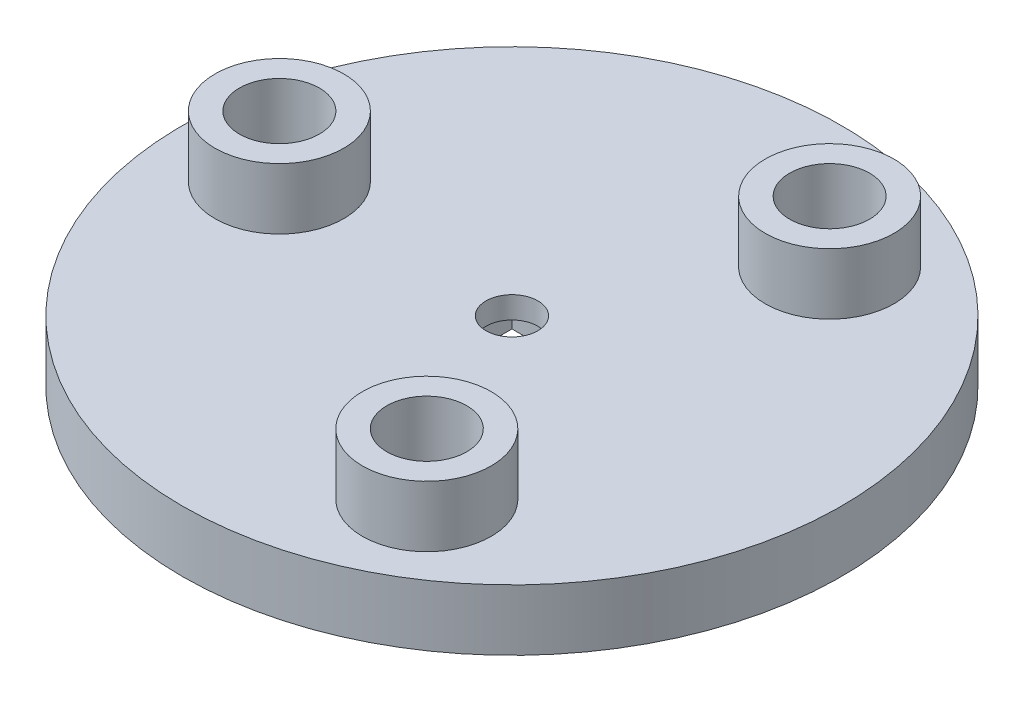
ISO-10303-21;
HEADER;
FILE_DESCRIPTION(('STEP AP214'),'2;1');
FILE_NAME('part.step','',(''),(''),'','','');
FILE_SCHEMA(('AUTOMOTIVE_DESIGN { 1 0 10303 214 1 1 1 1 }'));
ENDSEC;
DATA;
#1=APPLICATION_CONTEXT('core data for automotive mechanical design processes');
#2=APPLICATION_PROTOCOL_DEFINITION('international standard','automotive_design',2000,#1);
#3=PRODUCT_CONTEXT('',#1,'mechanical');
#4=PRODUCT('Part','Part','',(#3));
#5=PRODUCT_RELATED_PRODUCT_CATEGORY('part','',(#4));
#6=PRODUCT_DEFINITION_FORMATION('','',#4);
#7=PRODUCT_DEFINITION_CONTEXT('part definition',#1,'design');
#8=PRODUCT_DEFINITION('design','',#6,#7);
#9=PRODUCT_DEFINITION_SHAPE('','',#8);
#10=(LENGTH_UNIT() NAMED_UNIT(*) SI_UNIT(.MILLI.,.METRE.));
#11=(NAMED_UNIT(*) PLANE_ANGLE_UNIT() SI_UNIT($,.RADIAN.));
#12=(NAMED_UNIT(*) SI_UNIT($,.STERADIAN.) SOLID_ANGLE_UNIT());
#13=UNCERTAINTY_MEASURE_WITH_UNIT(LENGTH_MEASURE(1.E-05),#10,'distance_accuracy_value','');
#14=(GEOMETRIC_REPRESENTATION_CONTEXT(3) GLOBAL_UNCERTAINTY_ASSIGNED_CONTEXT((#13)) GLOBAL_UNIT_ASSIGNED_CONTEXT((#10,
#11,#12)) REPRESENTATION_CONTEXT('',''));
#15=CARTESIAN_POINT('',(0.,0.,0.));
#16=DIRECTION('',(0.,0.,1.));
#17=DIRECTION('',(1.,0.,0.));
#18=AXIS2_PLACEMENT_3D('',#15,#16,#17);
#19=CARTESIAN_POINT('',(0.,10.,3.04877650902924E-13));
#20=DIRECTION('',(0.,-1.,0.));
#21=DIRECTION('',(0.,0.,-1.));
#22=AXIS2_PLACEMENT_3D('',#19,#20,#21);
#23=CYLINDRICAL_SURFACE('',#22,2.125);
#24=CARTESIAN_POINT('',(0.,5.,3.04877650902924E-13));
#25=DIRECTION('',(0.,1.,0.));
#26=DIRECTION('',(0.,0.,1.));
#27=AXIS2_PLACEMENT_3D('',#24,#25,#26);
#28=CIRCLE('',#27,2.125);
#29=CARTESIAN_POINT('',(0.,5.,2.12500000000031));
#30=VERTEX_POINT('',#29);
#31=EDGE_CURVE('E147',#30,#30,#28,.T.);
#32=ORIENTED_EDGE('',*,*,#31,.T.);
#33=EDGE_LOOP('',(#32));
#34=FACE_BOUND('',#33,.T.);
#35=CARTESIAN_POINT('',(0.,3.2,3.04877650902924E-13));
#36=DIRECTION('',(0.,-1.,0.));
#37=DIRECTION('',(0.,0.,-1.));
#38=AXIS2_PLACEMENT_3D('',#35,#36,#37);
#39=CIRCLE('',#38,2.125);
#40=CARTESIAN_POINT('',(0.,3.2,-2.1249999999997));
#41=VERTEX_POINT('',#40);
#42=EDGE_CURVE('E50',#41,#41,#39,.T.);
#43=ORIENTED_EDGE('',*,*,#42,.T.);
#44=EDGE_LOOP('',(#43));
#45=FACE_BOUND('',#44,.T.);
#46=ADVANCED_FACE('F46',(#34,#45),#23,.F.);
#47=CARTESIAN_POINT('',(0.,10.,3.04877650902924E-13));
#48=DIRECTION('',(0.,1.,0.));
#49=DIRECTION('',(0.,0.,1.));
#50=AXIS2_PLACEMENT_3D('',#47,#48,#49);
#51=PLANE('',#50);
#52=CARTESIAN_POINT('',(9.52625000000018,10.,-16.4999490056029));
#53=DIRECTION('',(0.,-1.,0.));
#54=DIRECTION('',(0.,0.,-1.));
#55=AXIS2_PLACEMENT_3D('',#52,#53,#54);
#56=CIRCLE('',#55,3.27499999999973);
#57=CARTESIAN_POINT('',(9.52625000000018,10.,-19.7749490056027));
#58=VERTEX_POINT('',#57);
#59=EDGE_CURVE('E158',#58,#58,#56,.T.);
#60=ORIENTED_EDGE('',*,*,#59,.T.);
#61=EDGE_LOOP('',(#60));
#62=FACE_BOUND('',#61,.T.);
#63=CARTESIAN_POINT('',(9.52625000000018,10.,-16.4999490056029));
#64=DIRECTION('',(0.,1.,0.));
#65=DIRECTION('',(0.,0.,1.));
#66=AXIS2_PLACEMENT_3D('',#63,#64,#65);
#67=CIRCLE('',#66,5.27499999999971);
#68=CARTESIAN_POINT('',(9.52625000000018,10.,-11.2249490056032));
#69=VERTEX_POINT('',#68);
#70=EDGE_CURVE('E136',#69,#69,#67,.T.);
#71=ORIENTED_EDGE('',*,*,#70,.T.);
#72=EDGE_LOOP('',(#71));
#73=FACE_BOUND('',#72,.T.);
#74=ADVANCED_FACE('F197',(#62,#73),#51,.T.);
#75=CARTESIAN_POINT('',(9.52625000000018,2.5,-16.4999490056029));
#76=DIRECTION('',(0.,1.,0.));
#77=DIRECTION('',(0.,0.,1.));
#78=AXIS2_PLACEMENT_3D('',#75,#76,#77);
#79=CYLINDRICAL_SURFACE('',#78,3.27499999999973);
#80=CARTESIAN_POINT('',(9.52625000000018,2.5,-16.4999490056029));
#81=DIRECTION('',(0.,-1.,0.));
#82=DIRECTION('',(0.,0.,-1.));
#83=AXIS2_PLACEMENT_3D('',#80,#81,#82);
#84=CIRCLE('',#83,3.27499999999973);
#85=CARTESIAN_POINT('',(9.52625000000018,2.5,-19.7749490056027));
#86=VERTEX_POINT('',#85);
#87=EDGE_CURVE('E55',#86,#86,#84,.T.);
#88=ORIENTED_EDGE('',*,*,#87,.T.);
#89=EDGE_LOOP('',(#88));
#90=FACE_BOUND('',#89,.T.);
#91=ORIENTED_EDGE('',*,*,#59,.F.);
#92=EDGE_LOOP('',(#91));
#93=FACE_BOUND('',#92,.T.);
#94=ADVANCED_FACE('F203',(#90,#93),#79,.F.);
#95=CARTESIAN_POINT('',(9.52625000000018,2.5,-16.4999490056029));
#96=DIRECTION('',(0.,-1.,0.));
#97=DIRECTION('',(0.,0.,-1.));
#98=AXIS2_PLACEMENT_3D('',#95,#96,#97);
#99=PLANE('',#98);
#100=ORIENTED_EDGE('',*,*,#87,.F.);
#101=EDGE_LOOP('',(#100));
#102=FACE_BOUND('',#101,.T.);
#103=ADVANCED_FACE('F173',(#102),#99,.F.);
#104=CARTESIAN_POINT('',(0.,5.,3.04877650902924E-13));
#105=DIRECTION('',(0.,1.,0.));
#106=DIRECTION('',(0.,0.,1.));
#107=AXIS2_PLACEMENT_3D('',#104,#105,#106);
#108=PLANE('',#107);
#109=ORIENTED_EDGE('',*,*,#31,.F.);
#110=EDGE_LOOP('',(#109));
#111=FACE_BOUND('',#110,.T.);
#112=CARTESIAN_POINT('',(-19.0524999999996,5.,0.));
#113=DIRECTION('',(0.,1.,0.));
#114=DIRECTION('',(0.,0.,1.));
#115=AXIS2_PLACEMENT_3D('',#112,#113,#114);
#116=CIRCLE('',#115,5.27499999999964);
#117=CARTESIAN_POINT('',(-19.0524999999996,5.,5.2749999999997));
#118=VERTEX_POINT('',#117);
#119=EDGE_CURVE('E126',#118,#118,#116,.T.);
#120=ORIENTED_EDGE('',*,*,#119,.F.);
#121=EDGE_LOOP('',(#120));
#122=FACE_BOUND('',#121,.T.);
#123=CARTESIAN_POINT('',(9.52625000000006,5.,16.4999490056029));
#124=DIRECTION('',(0.,1.,0.));
#125=DIRECTION('',(0.,0.,1.));
#126=AXIS2_PLACEMENT_3D('',#123,#124,#125);
#127=CIRCLE('',#126,5.275);
#128=CARTESIAN_POINT('',(9.52625000000006,5.,21.7749490056029));
#129=VERTEX_POINT('',#128);
#130=EDGE_CURVE('E133',#129,#129,#127,.T.);
#131=ORIENTED_EDGE('',*,*,#130,.F.);
#132=EDGE_LOOP('',(#131));
#133=FACE_BOUND('',#132,.T.);
#134=CARTESIAN_POINT('',(9.52625000000018,5.,-16.4999490056029));
#135=DIRECTION('',(0.,1.,0.));
#136=DIRECTION('',(0.,0.,1.));
#137=AXIS2_PLACEMENT_3D('',#134,#135,#136);
#138=CIRCLE('',#137,5.27499999999971);
#139=CARTESIAN_POINT('',(9.52625000000018,5.,-11.2249490056032));
#140=VERTEX_POINT('',#139);
#141=EDGE_CURVE('E139',#140,#140,#138,.T.);
#142=ORIENTED_EDGE('',*,*,#141,.F.);
#143=EDGE_LOOP('',(#142));
#144=FACE_BOUND('',#143,.T.);
#145=CARTESIAN_POINT('',(0.,5.,3.04877650902924E-13));
#146=DIRECTION('',(0.,1.,0.));
#147=DIRECTION('',(0.,0.,1.));
#148=AXIS2_PLACEMENT_3D('',#145,#146,#147);
#149=CIRCLE('',#148,27.);
#150=CARTESIAN_POINT('',(0.,5.,27.0000000000003));
#151=VERTEX_POINT('',#150);
#152=EDGE_CURVE('E142',#151,#151,#149,.T.);
#153=ORIENTED_EDGE('',*,*,#152,.T.);
#154=EDGE_LOOP('',(#153));
#155=FACE_BOUND('',#154,.T.);
#156=ADVANCED_FACE('F169',(#111,#122,#133,#144,#155),#108,.T.);
#157=CARTESIAN_POINT('',(9.52625000000018,5.,-16.4999490056029));
#158=DIRECTION('',(0.,1.,0.));
#159=DIRECTION('',(0.,0.,1.));
#160=AXIS2_PLACEMENT_3D('',#157,#158,#159);
#161=CYLINDRICAL_SURFACE('',#160,5.27499999999971);
#162=ORIENTED_EDGE('',*,*,#141,.T.);
#163=EDGE_LOOP('',(#162));
#164=FACE_BOUND('',#163,.T.);
#165=ORIENTED_EDGE('',*,*,#70,.F.);
#166=EDGE_LOOP('',(#165));
#167=FACE_BOUND('',#166,.T.);
#168=ADVANCED_FACE('F172',(#164,#167),#161,.T.);
#169=CARTESIAN_POINT('',(9.52625000000006,5.,16.4999490056029));
#170=DIRECTION('',(0.,1.,0.));
#171=DIRECTION('',(0.,0.,1.));
#172=AXIS2_PLACEMENT_3D('',#169,#170,#171);
#173=CYLINDRICAL_SURFACE('',#172,5.275);
#174=ORIENTED_EDGE('',*,*,#130,.T.);
#175=EDGE_LOOP('',(#174));
#176=FACE_BOUND('',#175,.T.);
#177=CARTESIAN_POINT('',(9.52625000000006,10.,16.4999490056029));
#178=DIRECTION('',(0.,1.,0.));
#179=DIRECTION('',(0.,0.,1.));
#180=AXIS2_PLACEMENT_3D('',#177,#178,#179);
#181=CIRCLE('',#180,5.275);
#182=CARTESIAN_POINT('',(9.52625000000006,10.,21.7749490056029));
#183=VERTEX_POINT('',#182);
#184=EDGE_CURVE('E129',#183,#183,#181,.T.);
#185=ORIENTED_EDGE('',*,*,#184,.F.);
#186=EDGE_LOOP('',(#185));
#187=FACE_BOUND('',#186,.T.);
#188=ADVANCED_FACE('F230',(#176,#187),#173,.T.);
#189=CARTESIAN_POINT('',(-19.0524999999996,5.,0.));
#190=DIRECTION('',(0.,1.,0.));
#191=DIRECTION('',(0.,0.,1.));
#192=AXIS2_PLACEMENT_3D('',#189,#190,#191);
#193=CYLINDRICAL_SURFACE('',#192,5.27499999999964);
#194=ORIENTED_EDGE('',*,*,#119,.T.);
#195=EDGE_LOOP('',(#194));
#196=FACE_BOUND('',#195,.T.);
#197=CARTESIAN_POINT('',(-19.0524999999996,10.,0.));
#198=DIRECTION('',(0.,1.,0.));
#199=DIRECTION('',(0.,0.,1.));
#200=AXIS2_PLACEMENT_3D('',#197,#198,#199);
#201=CIRCLE('',#200,5.27499999999964);
#202=CARTESIAN_POINT('',(-19.0524999999996,10.,5.2749999999997));
#203=VERTEX_POINT('',#202);
#204=EDGE_CURVE('E130',#203,#203,#201,.T.);
#205=ORIENTED_EDGE('',*,*,#204,.F.);
#206=EDGE_LOOP('',(#205));
#207=FACE_BOUND('',#206,.T.);
#208=ADVANCED_FACE('F225',(#196,#207),#193,.T.);
#209=CARTESIAN_POINT('',(-19.0524999999996,2.5,0.));
#210=DIRECTION('',(0.,-1.,0.));
#211=DIRECTION('',(0.,0.,-1.));
#212=AXIS2_PLACEMENT_3D('',#209,#210,#211);
#213=PLANE('',#212);
#214=CARTESIAN_POINT('',(-19.0524999999996,2.5,0.));
#215=DIRECTION('',(0.,-1.,0.));
#216=DIRECTION('',(0.,0.,-1.));
#217=AXIS2_PLACEMENT_3D('',#214,#215,#216);
#218=CIRCLE('',#217,3.27499999999954);
#219=CARTESIAN_POINT('',(-19.0524999999996,2.5,-3.27499999999948));
#220=VERTEX_POINT('',#219);
#221=EDGE_CURVE('E148',#220,#220,#218,.T.);
#222=ORIENTED_EDGE('',*,*,#221,.F.);
#223=EDGE_LOOP('',(#222));
#224=FACE_BOUND('',#223,.T.);
#225=ADVANCED_FACE('F222',(#224),#213,.F.);
#226=CARTESIAN_POINT('',(-19.0524999999996,2.5,0.));
#227=DIRECTION('',(0.,1.,0.));
#228=DIRECTION('',(0.,0.,1.));
#229=AXIS2_PLACEMENT_3D('',#226,#227,#228);
#230=CYLINDRICAL_SURFACE('',#229,3.27499999999954);
#231=ORIENTED_EDGE('',*,*,#221,.T.);
#232=EDGE_LOOP('',(#231));
#233=FACE_BOUND('',#232,.T.);
#234=CARTESIAN_POINT('',(-19.0524999999996,10.,0.));
#235=DIRECTION('',(0.,-1.,0.));
#236=DIRECTION('',(0.,0.,-1.));
#237=AXIS2_PLACEMENT_3D('',#234,#235,#236);
#238=CIRCLE('',#237,3.27499999999954);
#239=CARTESIAN_POINT('',(-19.0524999999996,10.,-3.27499999999948));
#240=VERTEX_POINT('',#239);
#241=EDGE_CURVE('E152',#240,#240,#238,.T.);
#242=ORIENTED_EDGE('',*,*,#241,.F.);
#243=EDGE_LOOP('',(#242));
#244=FACE_BOUND('',#243,.T.);
#245=ADVANCED_FACE('F219',(#233,#244),#230,.F.);
#246=ORIENTED_EDGE('',*,*,#241,.T.);
#247=EDGE_LOOP('',(#246));
#248=FACE_BOUND('',#247,.T.);
#249=ORIENTED_EDGE('',*,*,#204,.T.);
#250=EDGE_LOOP('',(#249));
#251=FACE_BOUND('',#250,.T.);
#252=ADVANCED_FACE('F196',(#248,#251),#51,.T.);
#253=CARTESIAN_POINT('',(9.52625000000006,2.5,16.4999490056029));
#254=DIRECTION('',(0.,-1.,0.));
#255=DIRECTION('',(0.,0.,-1.));
#256=AXIS2_PLACEMENT_3D('',#253,#254,#255);
#257=PLANE('',#256);
#258=CARTESIAN_POINT('',(9.52625000000006,2.5,16.4999490056029));
#259=DIRECTION('',(0.,-1.,0.));
#260=DIRECTION('',(0.,0.,-1.));
#261=AXIS2_PLACEMENT_3D('',#258,#259,#260);
#262=CIRCLE('',#261,3.275);
#263=CARTESIAN_POINT('',(9.52625000000006,2.5,13.2249490056029));
#264=VERTEX_POINT('',#263);
#265=EDGE_CURVE('E155',#264,#264,#262,.T.);
#266=ORIENTED_EDGE('',*,*,#265,.F.);
#267=EDGE_LOOP('',(#266));
#268=FACE_BOUND('',#267,.T.);
#269=ADVANCED_FACE('F214',(#268),#257,.F.);
#270=CARTESIAN_POINT('',(9.52625000000006,2.5,16.4999490056029));
#271=DIRECTION('',(0.,1.,0.));
#272=DIRECTION('',(0.,0.,1.));
#273=AXIS2_PLACEMENT_3D('',#270,#271,#272);
#274=CYLINDRICAL_SURFACE('',#273,3.275);
#275=ORIENTED_EDGE('',*,*,#265,.T.);
#276=EDGE_LOOP('',(#275));
#277=FACE_BOUND('',#276,.T.);
#278=CARTESIAN_POINT('',(9.52625000000006,10.,16.4999490056029));
#279=DIRECTION('',(0.,-1.,0.));
#280=DIRECTION('',(0.,0.,-1.));
#281=AXIS2_PLACEMENT_3D('',#278,#279,#280);
#282=CIRCLE('',#281,3.275);
#283=CARTESIAN_POINT('',(9.52625000000006,10.,13.2249490056029));
#284=VERTEX_POINT('',#283);
#285=EDGE_CURVE('E151',#284,#284,#282,.T.);
#286=ORIENTED_EDGE('',*,*,#285,.F.);
#287=EDGE_LOOP('',(#286));
#288=FACE_BOUND('',#287,.T.);
#289=ADVANCED_FACE('F193',(#277,#288),#274,.F.);
#290=ORIENTED_EDGE('',*,*,#285,.T.);
#291=EDGE_LOOP('',(#290));
#292=FACE_BOUND('',#291,.T.);
#293=ORIENTED_EDGE('',*,*,#184,.T.);
#294=EDGE_LOOP('',(#293));
#295=FACE_BOUND('',#294,.T.);
#296=ADVANCED_FACE('F185',(#292,#295),#51,.T.);
#297=CARTESIAN_POINT('',(0.,10.,3.04877650902924E-13));
#298=DIRECTION('',(0.,-1.,0.));
#299=DIRECTION('',(0.,0.,-1.));
#300=AXIS2_PLACEMENT_3D('',#297,#298,#299);
#301=CYLINDRICAL_SURFACE('',#300,27.);
#302=CARTESIAN_POINT('',(0.,0.,3.04877650902924E-13));
#303=DIRECTION('',(0.,1.,0.));
#304=DIRECTION('',(0.,0.,1.));
#305=AXIS2_PLACEMENT_3D('',#302,#303,#304);
#306=CIRCLE('',#305,27.);
#307=CARTESIAN_POINT('',(0.,0.,27.0000000000003));
#308=VERTEX_POINT('',#307);
#309=EDGE_CURVE('E13',#308,#308,#306,.T.);
#310=ORIENTED_EDGE('',*,*,#309,.T.);
#311=EDGE_LOOP('',(#310));
#312=FACE_BOUND('',#311,.T.);
#313=ORIENTED_EDGE('',*,*,#152,.F.);
#314=EDGE_LOOP('',(#313));
#315=FACE_BOUND('',#314,.T.);
#316=ADVANCED_FACE('F48',(#312,#315),#301,.T.);
#317=CARTESIAN_POINT('',(0.,0.,3.04877650902924E-13));
#318=DIRECTION('',(0.,1.,0.));
#319=DIRECTION('',(0.,0.,1.));
#320=AXIS2_PLACEMENT_3D('',#317,#318,#319);
#321=PLANE('',#320);
#322=DIRECTION('',(-1.,0.,0.));
#323=VECTOR('',#322,1.);
#324=CARTESIAN_POINT('',(4.064,0.,4.065));
#325=LINE('',#324,#323);
#326=CARTESIAN_POINT('',(4.064,0.,4.065));
#327=VERTEX_POINT('',#326);
#328=CARTESIAN_POINT('',(-4.064,0.,4.065));
#329=VERTEX_POINT('',#328);
#330=EDGE_CURVE('E98',#327,#329,#325,.T.);
#331=ORIENTED_EDGE('',*,*,#330,.F.);
#332=DIRECTION('',(0.,0.,1.));
#333=VECTOR('',#332,1.);
#334=CARTESIAN_POINT('',(4.064,0.,-4.065));
#335=LINE('',#334,#333);
#336=CARTESIAN_POINT('',(4.064,0.,-4.065));
#337=VERTEX_POINT('',#336);
#338=EDGE_CURVE('E63',#337,#327,#335,.T.);
#339=ORIENTED_EDGE('',*,*,#338,.F.);
#340=DIRECTION('',(1.,0.,0.));
#341=VECTOR('',#340,1.);
#342=CARTESIAN_POINT('',(4.064,0.,-4.065));
#343=LINE('',#342,#341);
#344=CARTESIAN_POINT('',(-4.064,0.,-4.065));
#345=VERTEX_POINT('',#344);
#346=EDGE_CURVE('E114',#345,#337,#343,.T.);
#347=ORIENTED_EDGE('',*,*,#346,.F.);
#348=DIRECTION('',(0.,0.,-1.));
#349=VECTOR('',#348,1.);
#350=CARTESIAN_POINT('',(-4.064,0.,-4.065));
#351=LINE('',#350,#349);
#352=EDGE_CURVE('E120',#329,#345,#351,.T.);
#353=ORIENTED_EDGE('',*,*,#352,.F.);
#354=EDGE_LOOP('',(#331,#339,#347,#353));
#355=FACE_BOUND('',#354,.T.);
#356=ORIENTED_EDGE('',*,*,#309,.F.);
#357=EDGE_LOOP('',(#356));
#358=FACE_BOUND('',#357,.T.);
#359=ADVANCED_FACE('F184',(#355,#358),#321,.F.);
#360=CARTESIAN_POINT('',(4.064,3.2,-4.065));
#361=DIRECTION('',(1.,0.,0.));
#362=DIRECTION('',(0.,0.,-1.));
#363=AXIS2_PLACEMENT_3D('',#360,#361,#362);
#364=PLANE('',#363);
#365=ORIENTED_EDGE('',*,*,#338,.T.);
#366=DIRECTION('',(0.,-1.,0.));
#367=VECTOR('',#366,1.);
#368=CARTESIAN_POINT('',(4.064,3.2,4.065));
#369=LINE('',#368,#367);
#370=CARTESIAN_POINT('',(4.064,3.2,4.065));
#371=VERTEX_POINT('',#370);
#372=EDGE_CURVE('E86',#371,#327,#369,.T.);
#373=ORIENTED_EDGE('',*,*,#372,.F.);
#374=DIRECTION('',(0.,0.,1.));
#375=VECTOR('',#374,1.);
#376=CARTESIAN_POINT('',(4.064,3.2,-4.065));
#377=LINE('',#376,#375);
#378=CARTESIAN_POINT('',(4.064,3.2,-4.065));
#379=VERTEX_POINT('',#378);
#380=EDGE_CURVE('E112',#379,#371,#377,.T.);
#381=ORIENTED_EDGE('',*,*,#380,.F.);
#382=DIRECTION('',(0.,-1.,0.));
#383=VECTOR('',#382,1.);
#384=CARTESIAN_POINT('',(4.064,3.2,-4.065));
#385=LINE('',#384,#383);
#386=EDGE_CURVE('E71',#379,#337,#385,.T.);
#387=ORIENTED_EDGE('',*,*,#386,.T.);
#388=EDGE_LOOP('',(#365,#373,#381,#387));
#389=FACE_BOUND('',#388,.T.);
#390=ADVANCED_FACE('F191',(#389),#364,.F.);
#391=CARTESIAN_POINT('',(4.064,3.2,-4.065));
#392=DIRECTION('',(0.,0.,-1.));
#393=DIRECTION('',(-1.,0.,0.));
#394=AXIS2_PLACEMENT_3D('',#391,#392,#393);
#395=PLANE('',#394);
#396=ORIENTED_EDGE('',*,*,#346,.T.);
#397=ORIENTED_EDGE('',*,*,#386,.F.);
#398=DIRECTION('',(1.,0.,0.));
#399=VECTOR('',#398,1.);
#400=CARTESIAN_POINT('',(4.064,3.2,-4.065));
#401=LINE('',#400,#399);
#402=CARTESIAN_POINT('',(-4.064,3.2,-4.065));
#403=VERTEX_POINT('',#402);
#404=EDGE_CURVE('E109',#403,#379,#401,.T.);
#405=ORIENTED_EDGE('',*,*,#404,.F.);
#406=DIRECTION('',(0.,-1.,0.));
#407=VECTOR('',#406,1.);
#408=CARTESIAN_POINT('',(-4.064,3.2,-4.065));
#409=LINE('',#408,#407);
#410=EDGE_CURVE('E102',#403,#345,#409,.T.);
#411=ORIENTED_EDGE('',*,*,#410,.T.);
#412=EDGE_LOOP('',(#396,#397,#405,#411));
#413=FACE_BOUND('',#412,.T.);
#414=ADVANCED_FACE('F240',(#413),#395,.F.);
#415=CARTESIAN_POINT('',(-4.064,3.2,-4.065));
#416=DIRECTION('',(-1.,0.,0.));
#417=DIRECTION('',(0.,0.,1.));
#418=AXIS2_PLACEMENT_3D('',#415,#416,#417);
#419=PLANE('',#418);
#420=ORIENTED_EDGE('',*,*,#352,.T.);
#421=ORIENTED_EDGE('',*,*,#410,.F.);
#422=DIRECTION('',(0.,0.,-1.));
#423=VECTOR('',#422,1.);
#424=CARTESIAN_POINT('',(-4.064,3.2,-4.065));
#425=LINE('',#424,#423);
#426=CARTESIAN_POINT('',(-4.064,3.2,4.065));
#427=VERTEX_POINT('',#426);
#428=EDGE_CURVE('E105',#427,#403,#425,.T.);
#429=ORIENTED_EDGE('',*,*,#428,.F.);
#430=DIRECTION('',(0.,-1.,0.));
#431=VECTOR('',#430,1.);
#432=CARTESIAN_POINT('',(-4.064,3.2,4.065));
#433=LINE('',#432,#431);
#434=EDGE_CURVE('E91',#427,#329,#433,.T.);
#435=ORIENTED_EDGE('',*,*,#434,.T.);
#436=EDGE_LOOP('',(#420,#421,#429,#435));
#437=FACE_BOUND('',#436,.T.);
#438=ADVANCED_FACE('F106',(#437),#419,.F.);
#439=CARTESIAN_POINT('',(4.064,3.2,4.065));
#440=DIRECTION('',(0.,0.,1.));
#441=DIRECTION('',(1.,0.,0.));
#442=AXIS2_PLACEMENT_3D('',#439,#440,#441);
#443=PLANE('',#442);
#444=ORIENTED_EDGE('',*,*,#330,.T.);
#445=ORIENTED_EDGE('',*,*,#434,.F.);
#446=DIRECTION('',(-1.,0.,0.));
#447=VECTOR('',#446,1.);
#448=CARTESIAN_POINT('',(4.064,3.2,4.065));
#449=LINE('',#448,#447);
#450=EDGE_CURVE('E95',#371,#427,#449,.T.);
#451=ORIENTED_EDGE('',*,*,#450,.F.);
#452=ORIENTED_EDGE('',*,*,#372,.T.);
#453=EDGE_LOOP('',(#444,#445,#451,#452));
#454=FACE_BOUND('',#453,.T.);
#455=ADVANCED_FACE('F93',(#454),#443,.F.);
#456=CARTESIAN_POINT('',(0.,3.2,0.));
#457=DIRECTION('',(0.,-1.,0.));
#458=DIRECTION('',(0.,0.,-1.));
#459=AXIS2_PLACEMENT_3D('',#456,#457,#458);
#460=PLANE('',#459);
#461=ORIENTED_EDGE('',*,*,#42,.F.);
#462=EDGE_LOOP('',(#461));
#463=FACE_BOUND('',#462,.T.);
#464=ORIENTED_EDGE('',*,*,#380,.T.);
#465=ORIENTED_EDGE('',*,*,#450,.T.);
#466=ORIENTED_EDGE('',*,*,#428,.T.);
#467=ORIENTED_EDGE('',*,*,#404,.T.);
#468=EDGE_LOOP('',(#464,#465,#466,#467));
#469=FACE_BOUND('',#468,.T.);
#470=ADVANCED_FACE('F111',(#463,#469),#460,.T.);
#471=CLOSED_SHELL('',(#46,#74,#94,#103,#156,#168,#188,#208,#225,#245,#252,#269,#289,#296,#316,
#359,#390,#414,#438,#455,#470));
#472=MANIFOLD_SOLID_BREP('B2',#471);
#473=ADVANCED_BREP_SHAPE_REPRESENTATION('',(#18,#472),#14);
#474=SHAPE_DEFINITION_REPRESENTATION(#9,#473);
ENDSEC;
END-ISO-10303-21;
